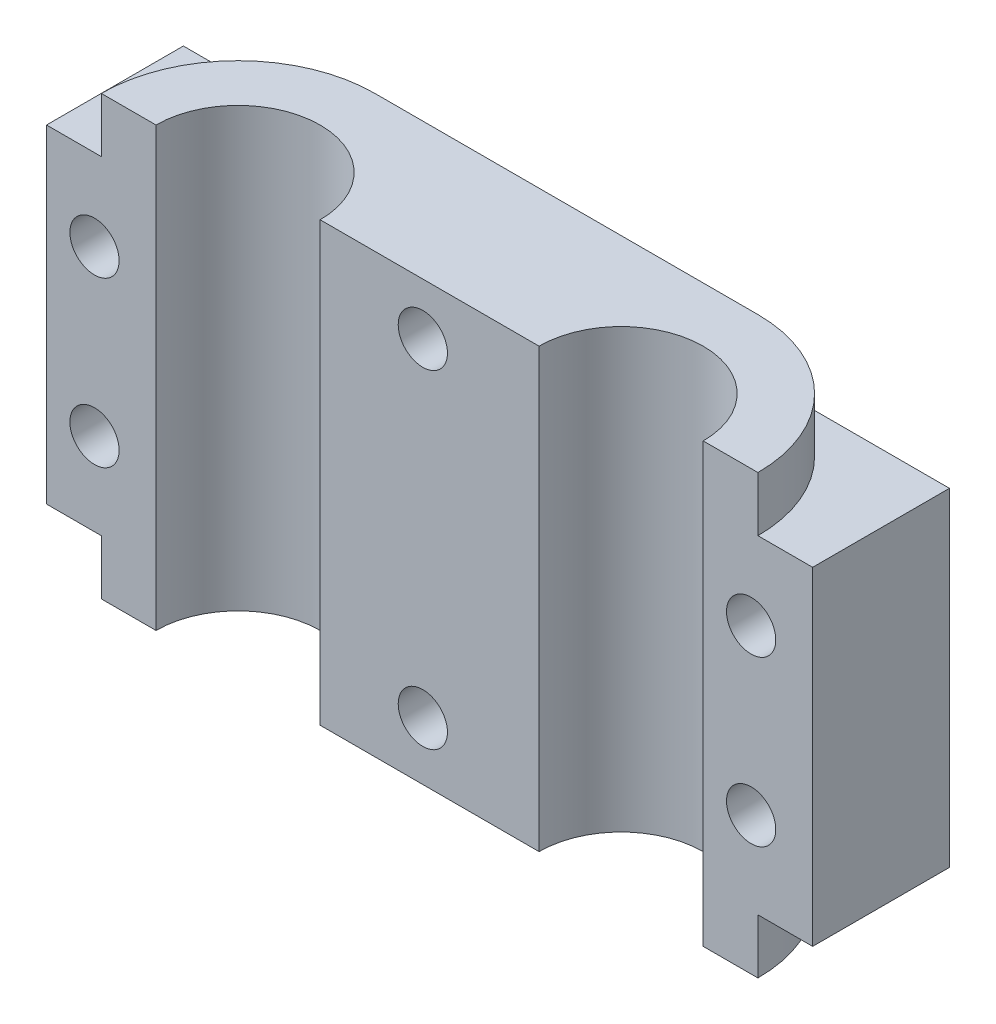
ISO-10303-21;
HEADER;
FILE_DESCRIPTION(('STEP AP214'),'2;1');
FILE_NAME('part.step','',(''),(''),'','','');
FILE_SCHEMA(('AUTOMOTIVE_DESIGN { 1 0 10303 214 1 1 1 1 }'));
ENDSEC;
DATA;
#1=APPLICATION_CONTEXT('core data for automotive mechanical design processes');
#2=APPLICATION_PROTOCOL_DEFINITION('international standard','automotive_design',2000,#1);
#3=PRODUCT_CONTEXT('',#1,'mechanical');
#4=PRODUCT('Part','Part','',(#3));
#5=PRODUCT_RELATED_PRODUCT_CATEGORY('part','',(#4));
#6=PRODUCT_DEFINITION_FORMATION('','',#4);
#7=PRODUCT_DEFINITION_CONTEXT('part definition',#1,'design');
#8=PRODUCT_DEFINITION('design','',#6,#7);
#9=PRODUCT_DEFINITION_SHAPE('','',#8);
#10=(LENGTH_UNIT() NAMED_UNIT(*) SI_UNIT(.MILLI.,.METRE.));
#11=(NAMED_UNIT(*) PLANE_ANGLE_UNIT() SI_UNIT($,.RADIAN.));
#12=(NAMED_UNIT(*) SI_UNIT($,.STERADIAN.) SOLID_ANGLE_UNIT());
#13=UNCERTAINTY_MEASURE_WITH_UNIT(LENGTH_MEASURE(1.E-05),#10,'distance_accuracy_value','');
#14=(GEOMETRIC_REPRESENTATION_CONTEXT(3) GLOBAL_UNCERTAINTY_ASSIGNED_CONTEXT((#13)) GLOBAL_UNIT_ASSIGNED_CONTEXT((#10,
#11,#12)) REPRESENTATION_CONTEXT('',''));
#15=CARTESIAN_POINT('',(0.,0.,0.));
#16=DIRECTION('',(0.,0.,1.));
#17=DIRECTION('',(1.,0.,0.));
#18=AXIS2_PLACEMENT_3D('',#15,#16,#17);
#19=CARTESIAN_POINT('',(17.5,20.,0.));
#20=DIRECTION('',(0.,-1.,0.));
#21=DIRECTION('',(0.,0.,-1.));
#22=AXIS2_PLACEMENT_3D('',#19,#20,#21);
#23=CYLINDRICAL_SURFACE('',#22,12.5);
#24=CARTESIAN_POINT('',(17.5,-15.,0.));
#25=DIRECTION('',(0.,1.,0.));
#26=DIRECTION('',(0.,0.,1.));
#27=AXIS2_PLACEMENT_3D('',#24,#25,#26);
#28=CIRCLE('',#27,12.5);
#29=CARTESIAN_POINT('',(30.,-15.,0.));
#30=VERTEX_POINT('',#29);
#31=CARTESIAN_POINT('',(17.5,-15.,-12.5));
#32=VERTEX_POINT('',#31);
#33=EDGE_CURVE('E54',#30,#32,#28,.T.);
#34=ORIENTED_EDGE('',*,*,#33,.F.);
#35=DIRECTION('',(0.,-1.,0.));
#36=VECTOR('',#35,1.);
#37=CARTESIAN_POINT('',(30.,20.,0.));
#38=LINE('',#37,#36);
#39=CARTESIAN_POINT('',(30.,-20.,0.));
#40=VERTEX_POINT('',#39);
#41=EDGE_CURVE('E47',#30,#40,#38,.T.);
#42=ORIENTED_EDGE('',*,*,#41,.T.);
#43=CARTESIAN_POINT('',(17.5,-20.,0.));
#44=DIRECTION('',(0.,1.,0.));
#45=DIRECTION('',(0.,0.,1.));
#46=AXIS2_PLACEMENT_3D('',#43,#44,#45);
#47=CIRCLE('',#46,12.5);
#48=CARTESIAN_POINT('',(17.5,-20.,-12.5));
#49=VERTEX_POINT('',#48);
#50=EDGE_CURVE('E213',#40,#49,#47,.T.);
#51=ORIENTED_EDGE('',*,*,#50,.T.);
#52=DIRECTION('',(0.,-1.,0.));
#53=VECTOR('',#52,1.);
#54=CARTESIAN_POINT('',(17.5,20.,-12.5));
#55=LINE('',#54,#53);
#56=EDGE_CURVE('E244',#32,#49,#55,.T.);
#57=ORIENTED_EDGE('',*,*,#56,.F.);
#58=EDGE_LOOP('',(#34,#42,#51,#57));
#59=FACE_BOUND('',#58,.T.);
#60=ADVANCED_FACE('F39',(#59),#23,.T.);
#61=CARTESIAN_POINT('',(-17.5,20.,0.));
#62=DIRECTION('',(0.,-1.,0.));
#63=DIRECTION('',(0.,0.,-1.));
#64=AXIS2_PLACEMENT_3D('',#61,#62,#63);
#65=CYLINDRICAL_SURFACE('',#64,12.5);
#66=DIRECTION('',(0.,-1.,0.));
#67=VECTOR('',#66,1.);
#68=CARTESIAN_POINT('',(-30.,20.,0.));
#69=LINE('',#68,#67);
#70=CARTESIAN_POINT('',(-30.,-15.,0.));
#71=VERTEX_POINT('',#70);
#72=CARTESIAN_POINT('',(-30.,-20.,0.));
#73=VERTEX_POINT('',#72);
#74=EDGE_CURVE('E237',#71,#73,#69,.T.);
#75=ORIENTED_EDGE('',*,*,#74,.F.);
#76=CARTESIAN_POINT('',(-17.5,-15.,0.));
#77=DIRECTION('',(0.,1.,0.));
#78=DIRECTION('',(0.,0.,1.));
#79=AXIS2_PLACEMENT_3D('',#76,#77,#78);
#80=CIRCLE('',#79,12.5);
#81=CARTESIAN_POINT('',(-17.5,-15.,-12.5));
#82=VERTEX_POINT('',#81);
#83=EDGE_CURVE('E263',#71,#82,#80,.F.);
#84=ORIENTED_EDGE('',*,*,#83,.T.);
#85=DIRECTION('',(0.,-1.,0.));
#86=VECTOR('',#85,1.);
#87=CARTESIAN_POINT('',(-17.5,20.,-12.5));
#88=LINE('',#87,#86);
#89=CARTESIAN_POINT('',(-17.5,-20.,-12.5));
#90=VERTEX_POINT('',#89);
#91=EDGE_CURVE('E241',#82,#90,#88,.T.);
#92=ORIENTED_EDGE('',*,*,#91,.T.);
#93=CARTESIAN_POINT('',(-17.5,-20.,0.));
#94=DIRECTION('',(0.,1.,0.));
#95=DIRECTION('',(0.,0.,1.));
#96=AXIS2_PLACEMENT_3D('',#93,#94,#95);
#97=CIRCLE('',#96,12.5);
#98=EDGE_CURVE('E219',#73,#90,#97,.F.);
#99=ORIENTED_EDGE('',*,*,#98,.F.);
#100=EDGE_LOOP('',(#75,#84,#92,#99));
#101=FACE_BOUND('',#100,.T.);
#102=ADVANCED_FACE('F261',(#101),#65,.T.);
#103=CARTESIAN_POINT('',(0.,20.,0.));
#104=DIRECTION('',(0.,0.,-1.));
#105=DIRECTION('',(-1.,0.,0.));
#106=AXIS2_PLACEMENT_3D('',#103,#104,#105);
#107=PLANE('',#106);
#108=CARTESIAN_POINT('',(29.3812113375367,-7.42900474648422,0.));
#109=DIRECTION('',(0.,0.,-1.));
#110=DIRECTION('',(-1.,0.,0.));
#111=AXIS2_PLACEMENT_3D('',#108,#109,#110);
#112=CIRCLE('',#111,2.24999999999999);
#113=CARTESIAN_POINT('',(27.1312113375367,-7.42900474648422,0.));
#114=VERTEX_POINT('',#113);
#115=EDGE_CURVE('E347',#114,#114,#112,.T.);
#116=ORIENTED_EDGE('',*,*,#115,.T.);
#117=EDGE_LOOP('',(#116));
#118=FACE_BOUND('',#117,.T.);
#119=CARTESIAN_POINT('',(29.3812113375367,7.57099525351577,0.));
#120=DIRECTION('',(0.,0.,-1.));
#121=DIRECTION('',(-1.,0.,0.));
#122=AXIS2_PLACEMENT_3D('',#119,#120,#121);
#123=CIRCLE('',#122,2.24999999999999);
#124=CARTESIAN_POINT('',(27.1312113375367,7.57099525351577,0.));
#125=VERTEX_POINT('',#124);
#126=EDGE_CURVE('E319',#125,#125,#123,.T.);
#127=ORIENTED_EDGE('',*,*,#126,.T.);
#128=EDGE_LOOP('',(#127));
#129=FACE_BOUND('',#128,.T.);
#130=DIRECTION('',(1.,0.,0.));
#131=VECTOR('',#130,1.);
#132=CARTESIAN_POINT('',(0.,-20.,0.));
#133=LINE('',#132,#131);
#134=CARTESIAN_POINT('',(25.,-20.,0.));
#135=VERTEX_POINT('',#134);
#136=EDGE_CURVE('E211',#135,#40,#133,.T.);
#137=ORIENTED_EDGE('',*,*,#136,.T.);
#138=ORIENTED_EDGE('',*,*,#41,.F.);
#139=DIRECTION('',(1.,0.,0.));
#140=VECTOR('',#139,1.);
#141=CARTESIAN_POINT('',(0.,-15.,0.));
#142=LINE('',#141,#140);
#143=CARTESIAN_POINT('',(35.,-15.,0.));
#144=VERTEX_POINT('',#143);
#145=EDGE_CURVE('E315',#30,#144,#142,.T.);
#146=ORIENTED_EDGE('',*,*,#145,.T.);
#147=DIRECTION('',(0.,-1.,0.));
#148=VECTOR('',#147,1.);
#149=CARTESIAN_POINT('',(35.,15.,0.));
#150=LINE('',#149,#148);
#151=CARTESIAN_POINT('',(35.,15.,0.));
#152=VERTEX_POINT('',#151);
#153=EDGE_CURVE('E158',#152,#144,#150,.T.);
#154=ORIENTED_EDGE('',*,*,#153,.F.);
#155=DIRECTION('',(1.,0.,0.));
#156=VECTOR('',#155,1.);
#157=CARTESIAN_POINT('',(0.,15.,0.));
#158=LINE('',#157,#156);
#159=CARTESIAN_POINT('',(30.,15.,0.));
#160=VERTEX_POINT('',#159);
#161=EDGE_CURVE('E153',#160,#152,#158,.T.);
#162=ORIENTED_EDGE('',*,*,#161,.F.);
#163=CARTESIAN_POINT('',(30.,20.,0.));
#164=VERTEX_POINT('',#163);
#165=EDGE_CURVE('E11',#164,#160,#38,.T.);
#166=ORIENTED_EDGE('',*,*,#165,.F.);
#167=DIRECTION('',(1.,0.,0.));
#168=VECTOR('',#167,1.);
#169=CARTESIAN_POINT('',(0.,20.,0.));
#170=LINE('',#169,#168);
#171=CARTESIAN_POINT('',(25.,20.,0.));
#172=VERTEX_POINT('',#171);
#173=EDGE_CURVE('E180',#172,#164,#170,.T.);
#174=ORIENTED_EDGE('',*,*,#173,.F.);
#175=DIRECTION('',(0.,-1.,0.));
#176=VECTOR('',#175,1.);
#177=CARTESIAN_POINT('',(25.,20.,0.));
#178=LINE('',#177,#176);
#179=EDGE_CURVE('E210',#172,#135,#178,.T.);
#180=ORIENTED_EDGE('',*,*,#179,.T.);
#181=EDGE_LOOP('',(#137,#138,#146,#154,#162,#166,#174,#180));
#182=FACE_BOUND('',#181,.T.);
#183=ADVANCED_FACE('F41',(#118,#129,#182),#107,.F.);
#184=ORIENTED_EDGE('',*,*,#165,.T.);
#185=CARTESIAN_POINT('',(17.5,15.,0.));
#186=DIRECTION('',(0.,1.,0.));
#187=DIRECTION('',(0.,0.,1.));
#188=AXIS2_PLACEMENT_3D('',#185,#186,#187);
#189=CIRCLE('',#188,12.5);
#190=CARTESIAN_POINT('',(17.5,15.,-12.5));
#191=VERTEX_POINT('',#190);
#192=EDGE_CURVE('E162',#160,#191,#189,.T.);
#193=ORIENTED_EDGE('',*,*,#192,.T.);
#194=CARTESIAN_POINT('',(17.5,20.,-12.5));
#195=VERTEX_POINT('',#194);
#196=EDGE_CURVE('E176',#195,#191,#55,.T.);
#197=ORIENTED_EDGE('',*,*,#196,.F.);
#198=CARTESIAN_POINT('',(17.5,20.,0.));
#199=DIRECTION('',(0.,1.,0.));
#200=DIRECTION('',(0.,0.,1.));
#201=AXIS2_PLACEMENT_3D('',#198,#199,#200);
#202=CIRCLE('',#201,12.5);
#203=EDGE_CURVE('E174',#164,#195,#202,.T.);
#204=ORIENTED_EDGE('',*,*,#203,.F.);
#205=EDGE_LOOP('',(#184,#193,#197,#204));
#206=FACE_BOUND('',#205,.T.);
#207=ADVANCED_FACE('F173',(#206),#23,.T.);
#208=CARTESIAN_POINT('',(0.,20.,-12.5));
#209=DIRECTION('',(0.,0.,1.));
#210=DIRECTION('',(1.,0.,0.));
#211=AXIS2_PLACEMENT_3D('',#208,#209,#210);
#212=PLANE('',#211);
#213=CARTESIAN_POINT('',(-0.618788662463317,-14.735944651477,-12.5));
#214=DIRECTION('',(0.,0.,-1.));
#215=DIRECTION('',(-1.,0.,0.));
#216=AXIS2_PLACEMENT_3D('',#213,#214,#215);
#217=CIRCLE('',#216,2.24999999999999);
#218=CARTESIAN_POINT('',(-2.86878866246331,-14.735944651477,-12.5));
#219=VERTEX_POINT('',#218);
#220=EDGE_CURVE('E356',#219,#219,#217,.T.);
#221=ORIENTED_EDGE('',*,*,#220,.F.);
#222=EDGE_LOOP('',(#221));
#223=FACE_BOUND('',#222,.T.);
#224=CARTESIAN_POINT('',(29.3812113375367,-7.42900474648422,-12.5));
#225=DIRECTION('',(0.,0.,-1.));
#226=DIRECTION('',(-1.,0.,0.));
#227=AXIS2_PLACEMENT_3D('',#224,#225,#226);
#228=CIRCLE('',#227,2.24999999999999);
#229=CARTESIAN_POINT('',(27.1312113375367,-7.42900474648422,-12.5));
#230=VERTEX_POINT('',#229);
#231=EDGE_CURVE('E350',#230,#230,#228,.T.);
#232=ORIENTED_EDGE('',*,*,#231,.F.);
#233=EDGE_LOOP('',(#232));
#234=FACE_BOUND('',#233,.T.);
#235=CARTESIAN_POINT('',(-30.6187886624633,-7.42900474648422,-12.5));
#236=DIRECTION('',(0.,0.,-1.));
#237=DIRECTION('',(-1.,0.,0.));
#238=AXIS2_PLACEMENT_3D('',#235,#236,#237);
#239=CIRCLE('',#238,2.24999999999999);
#240=CARTESIAN_POINT('',(-32.8687886624633,-7.42900474648422,-12.5));
#241=VERTEX_POINT('',#240);
#242=EDGE_CURVE('E344',#241,#241,#239,.T.);
#243=ORIENTED_EDGE('',*,*,#242,.F.);
#244=EDGE_LOOP('',(#243));
#245=FACE_BOUND('',#244,.T.);
#246=CARTESIAN_POINT('',(-30.6187886624633,7.57099525351577,-12.5));
#247=DIRECTION('',(0.,0.,-1.));
#248=DIRECTION('',(-1.,0.,0.));
#249=AXIS2_PLACEMENT_3D('',#246,#247,#248);
#250=CIRCLE('',#249,2.24999999999999);
#251=CARTESIAN_POINT('',(-32.8687886624633,7.57099525351577,-12.5));
#252=VERTEX_POINT('',#251);
#253=EDGE_CURVE('E338',#252,#252,#250,.T.);
#254=ORIENTED_EDGE('',*,*,#253,.F.);
#255=EDGE_LOOP('',(#254));
#256=FACE_BOUND('',#255,.T.);
#257=CARTESIAN_POINT('',(-0.618788662463317,15.264055348523,-12.5));
#258=DIRECTION('',(0.,0.,-1.));
#259=DIRECTION('',(-1.,0.,0.));
#260=AXIS2_PLACEMENT_3D('',#257,#258,#259);
#261=CIRCLE('',#260,2.24999999999999);
#262=CARTESIAN_POINT('',(-2.86878866246331,15.264055348523,-12.5));
#263=VERTEX_POINT('',#262);
#264=EDGE_CURVE('E332',#263,#263,#261,.T.);
#265=ORIENTED_EDGE('',*,*,#264,.F.);
#266=EDGE_LOOP('',(#265));
#267=FACE_BOUND('',#266,.T.);
#268=CARTESIAN_POINT('',(29.3812113375367,7.57099525351577,-12.5));
#269=DIRECTION('',(0.,0.,-1.));
#270=DIRECTION('',(-1.,0.,0.));
#271=AXIS2_PLACEMENT_3D('',#268,#269,#270);
#272=CIRCLE('',#271,2.24999999999999);
#273=CARTESIAN_POINT('',(27.1312113375367,7.57099525351577,-12.5));
#274=VERTEX_POINT('',#273);
#275=EDGE_CURVE('E326',#274,#274,#272,.T.);
#276=ORIENTED_EDGE('',*,*,#275,.F.);
#277=EDGE_LOOP('',(#276));
#278=FACE_BOUND('',#277,.T.);
#279=DIRECTION('',(-1.,0.,0.));
#280=VECTOR('',#279,1.);
#281=CARTESIAN_POINT('',(0.,-20.,-12.5));
#282=LINE('',#281,#280);
#283=EDGE_CURVE('E216',#49,#90,#282,.T.);
#284=ORIENTED_EDGE('',*,*,#283,.T.);
#285=ORIENTED_EDGE('',*,*,#91,.F.);
#286=DIRECTION('',(1.,0.,0.));
#287=VECTOR('',#286,1.);
#288=CARTESIAN_POINT('',(0.,-15.,-12.5));
#289=LINE('',#288,#287);
#290=CARTESIAN_POINT('',(-35.,-15.,-12.5));
#291=VERTEX_POINT('',#290);
#292=EDGE_CURVE('E265',#291,#82,#289,.T.);
#293=ORIENTED_EDGE('',*,*,#292,.F.);
#294=DIRECTION('',(0.,-1.,0.));
#295=VECTOR('',#294,1.);
#296=CARTESIAN_POINT('',(-35.,15.,-12.5));
#297=LINE('',#296,#295);
#298=CARTESIAN_POINT('',(-35.,15.,-12.5));
#299=VERTEX_POINT('',#298);
#300=EDGE_CURVE('E193',#299,#291,#297,.T.);
#301=ORIENTED_EDGE('',*,*,#300,.F.);
#302=DIRECTION('',(1.,0.,0.));
#303=VECTOR('',#302,1.);
#304=CARTESIAN_POINT('',(0.,15.,-12.5));
#305=LINE('',#304,#303);
#306=CARTESIAN_POINT('',(-17.5,15.,-12.5));
#307=VERTEX_POINT('',#306);
#308=EDGE_CURVE('E284',#299,#307,#305,.T.);
#309=ORIENTED_EDGE('',*,*,#308,.T.);
#310=CARTESIAN_POINT('',(-17.5,20.,-12.5));
#311=VERTEX_POINT('',#310);
#312=EDGE_CURVE('E242',#311,#307,#88,.T.);
#313=ORIENTED_EDGE('',*,*,#312,.F.);
#314=DIRECTION('',(-1.,0.,0.));
#315=VECTOR('',#314,1.);
#316=CARTESIAN_POINT('',(0.,20.,-12.5));
#317=LINE('',#316,#315);
#318=EDGE_CURVE('E179',#195,#311,#317,.T.);
#319=ORIENTED_EDGE('',*,*,#318,.F.);
#320=ORIENTED_EDGE('',*,*,#196,.T.);
#321=DIRECTION('',(-1.,0.,0.));
#322=VECTOR('',#321,1.);
#323=CARTESIAN_POINT('',(0.,15.,-12.5));
#324=LINE('',#323,#322);
#325=CARTESIAN_POINT('',(35.,15.,-12.5));
#326=VERTEX_POINT('',#325);
#327=EDGE_CURVE('E167',#326,#191,#324,.T.);
#328=ORIENTED_EDGE('',*,*,#327,.F.);
#329=DIRECTION('',(0.,-1.,0.));
#330=VECTOR('',#329,1.);
#331=CARTESIAN_POINT('',(35.,15.,-12.5));
#332=LINE('',#331,#330);
#333=CARTESIAN_POINT('',(35.,-15.,-12.5));
#334=VERTEX_POINT('',#333);
#335=EDGE_CURVE('E290',#326,#334,#332,.T.);
#336=ORIENTED_EDGE('',*,*,#335,.T.);
#337=DIRECTION('',(-1.,0.,0.));
#338=VECTOR('',#337,1.);
#339=CARTESIAN_POINT('',(0.,-15.,-12.5));
#340=LINE('',#339,#338);
#341=EDGE_CURVE('E171',#334,#32,#340,.T.);
#342=ORIENTED_EDGE('',*,*,#341,.T.);
#343=ORIENTED_EDGE('',*,*,#56,.T.);
#344=EDGE_LOOP('',(#284,#285,#293,#301,#309,#313,#319,#320,#328,#336,#342,#343));
#345=FACE_BOUND('',#344,.T.);
#346=ADVANCED_FACE('F247',(#223,#234,#245,#256,#267,#278,#345),#212,.F.);
#347=CARTESIAN_POINT('',(-17.5,15.,0.));
#348=DIRECTION('',(0.,1.,0.));
#349=DIRECTION('',(0.,0.,1.));
#350=AXIS2_PLACEMENT_3D('',#347,#348,#349);
#351=CIRCLE('',#350,12.5);
#352=CARTESIAN_POINT('',(-30.,15.,0.));
#353=VERTEX_POINT('',#352);
#354=EDGE_CURVE('E278',#353,#307,#351,.F.);
#355=ORIENTED_EDGE('',*,*,#354,.F.);
#356=CARTESIAN_POINT('',(-30.,20.,0.));
#357=VERTEX_POINT('',#356);
#358=EDGE_CURVE('E238',#357,#353,#69,.T.);
#359=ORIENTED_EDGE('',*,*,#358,.F.);
#360=CARTESIAN_POINT('',(-17.5,20.,0.));
#361=DIRECTION('',(0.,1.,0.));
#362=DIRECTION('',(0.,0.,1.));
#363=AXIS2_PLACEMENT_3D('',#360,#361,#362);
#364=CIRCLE('',#363,12.5);
#365=EDGE_CURVE('E197',#357,#311,#364,.F.);
#366=ORIENTED_EDGE('',*,*,#365,.T.);
#367=ORIENTED_EDGE('',*,*,#312,.T.);
#368=EDGE_LOOP('',(#355,#359,#366,#367));
#369=FACE_BOUND('',#368,.T.);
#370=ADVANCED_FACE('F301',(#369),#65,.T.);
#371=CARTESIAN_POINT('',(0.,20.,0.));
#372=DIRECTION('',(0.,0.,1.));
#373=DIRECTION('',(1.,0.,0.));
#374=AXIS2_PLACEMENT_3D('',#371,#372,#373);
#375=PLANE('',#374);
#376=CARTESIAN_POINT('',(-30.6187886624633,-7.42900474648422,0.));
#377=DIRECTION('',(0.,0.,1.));
#378=DIRECTION('',(1.,0.,0.));
#379=AXIS2_PLACEMENT_3D('',#376,#377,#378);
#380=CIRCLE('',#379,2.24999999999999);
#381=CARTESIAN_POINT('',(-28.3687886624633,-7.42900474648422,0.));
#382=VERTEX_POINT('',#381);
#383=EDGE_CURVE('E341',#382,#382,#380,.T.);
#384=ORIENTED_EDGE('',*,*,#383,.F.);
#385=EDGE_LOOP('',(#384));
#386=FACE_BOUND('',#385,.T.);
#387=CARTESIAN_POINT('',(-30.6187886624633,7.57099525351577,0.));
#388=DIRECTION('',(0.,0.,1.));
#389=DIRECTION('',(1.,0.,0.));
#390=AXIS2_PLACEMENT_3D('',#387,#388,#389);
#391=CIRCLE('',#390,2.24999999999999);
#392=CARTESIAN_POINT('',(-28.3687886624633,7.57099525351577,0.));
#393=VERTEX_POINT('',#392);
#394=EDGE_CURVE('E335',#393,#393,#391,.T.);
#395=ORIENTED_EDGE('',*,*,#394,.F.);
#396=EDGE_LOOP('',(#395));
#397=FACE_BOUND('',#396,.T.);
#398=DIRECTION('',(-1.,0.,0.));
#399=VECTOR('',#398,1.);
#400=CARTESIAN_POINT('',(0.,-20.,0.));
#401=LINE('',#400,#399);
#402=CARTESIAN_POINT('',(-25.,-20.,0.));
#403=VERTEX_POINT('',#402);
#404=EDGE_CURVE('E222',#403,#73,#401,.T.);
#405=ORIENTED_EDGE('',*,*,#404,.F.);
#406=DIRECTION('',(0.,-1.,0.));
#407=VECTOR('',#406,1.);
#408=CARTESIAN_POINT('',(-25.,20.,0.));
#409=LINE('',#408,#407);
#410=CARTESIAN_POINT('',(-25.,20.,0.));
#411=VERTEX_POINT('',#410);
#412=EDGE_CURVE('E235',#411,#403,#409,.T.);
#413=ORIENTED_EDGE('',*,*,#412,.F.);
#414=DIRECTION('',(-1.,0.,0.));
#415=VECTOR('',#414,1.);
#416=CARTESIAN_POINT('',(0.,20.,0.));
#417=LINE('',#416,#415);
#418=EDGE_CURVE('E200',#411,#357,#417,.T.);
#419=ORIENTED_EDGE('',*,*,#418,.T.);
#420=ORIENTED_EDGE('',*,*,#358,.T.);
#421=DIRECTION('',(-1.,0.,0.));
#422=VECTOR('',#421,1.);
#423=CARTESIAN_POINT('',(0.,15.,0.));
#424=LINE('',#423,#422);
#425=CARTESIAN_POINT('',(-35.,15.,0.));
#426=VERTEX_POINT('',#425);
#427=EDGE_CURVE('E275',#353,#426,#424,.T.);
#428=ORIENTED_EDGE('',*,*,#427,.T.);
#429=DIRECTION('',(0.,-1.,0.));
#430=VECTOR('',#429,1.);
#431=CARTESIAN_POINT('',(-35.,15.,0.));
#432=LINE('',#431,#430);
#433=CARTESIAN_POINT('',(-35.,-15.,0.));
#434=VERTEX_POINT('',#433);
#435=EDGE_CURVE('E281',#426,#434,#432,.T.);
#436=ORIENTED_EDGE('',*,*,#435,.T.);
#437=DIRECTION('',(-1.,0.,0.));
#438=VECTOR('',#437,1.);
#439=CARTESIAN_POINT('',(0.,-15.,0.));
#440=LINE('',#439,#438);
#441=EDGE_CURVE('E62',#71,#434,#440,.T.);
#442=ORIENTED_EDGE('',*,*,#441,.F.);
#443=ORIENTED_EDGE('',*,*,#74,.T.);
#444=EDGE_LOOP('',(#405,#413,#419,#420,#428,#436,#442,#443));
#445=FACE_BOUND('',#444,.T.);
#446=ADVANCED_FACE('F305',(#386,#397,#445),#375,.T.);
#447=CARTESIAN_POINT('',(-17.5,20.,0.));
#448=DIRECTION('',(0.,-1.,0.));
#449=DIRECTION('',(0.,0.,-1.));
#450=AXIS2_PLACEMENT_3D('',#447,#448,#449);
#451=CYLINDRICAL_SURFACE('',#450,7.5);
#452=CARTESIAN_POINT('',(-17.5,-20.,0.));
#453=DIRECTION('',(0.,1.,0.));
#454=DIRECTION('',(0.,0.,1.));
#455=AXIS2_PLACEMENT_3D('',#452,#453,#454);
#456=CIRCLE('',#455,7.5);
#457=CARTESIAN_POINT('',(-10.,-20.,0.));
#458=VERTEX_POINT('',#457);
#459=EDGE_CURVE('E225',#458,#403,#456,.T.);
#460=ORIENTED_EDGE('',*,*,#459,.F.);
#461=DIRECTION('',(0.,-1.,0.));
#462=VECTOR('',#461,1.);
#463=CARTESIAN_POINT('',(-10.,20.,0.));
#464=LINE('',#463,#462);
#465=CARTESIAN_POINT('',(-10.,20.,0.));
#466=VERTEX_POINT('',#465);
#467=EDGE_CURVE('E233',#466,#458,#464,.T.);
#468=ORIENTED_EDGE('',*,*,#467,.F.);
#469=CARTESIAN_POINT('',(-17.5,20.,0.));
#470=DIRECTION('',(0.,1.,0.));
#471=DIRECTION('',(0.,0.,1.));
#472=AXIS2_PLACEMENT_3D('',#469,#470,#471);
#473=CIRCLE('',#472,7.5);
#474=EDGE_CURVE('E203',#466,#411,#473,.T.);
#475=ORIENTED_EDGE('',*,*,#474,.T.);
#476=ORIENTED_EDGE('',*,*,#412,.T.);
#477=EDGE_LOOP('',(#460,#468,#475,#476));
#478=FACE_BOUND('',#477,.T.);
#479=ADVANCED_FACE('F308',(#478),#451,.F.);
#480=CARTESIAN_POINT('',(0.,20.,0.));
#481=DIRECTION('',(0.,0.,1.));
#482=DIRECTION('',(1.,0.,0.));
#483=AXIS2_PLACEMENT_3D('',#480,#481,#482);
#484=PLANE('',#483);
#485=CARTESIAN_POINT('',(-0.618788662463317,-14.735944651477,0.));
#486=DIRECTION('',(0.,0.,1.));
#487=DIRECTION('',(1.,0.,0.));
#488=AXIS2_PLACEMENT_3D('',#485,#486,#487);
#489=CIRCLE('',#488,2.24999999999999);
#490=CARTESIAN_POINT('',(1.63121133753667,-14.735944651477,0.));
#491=VERTEX_POINT('',#490);
#492=EDGE_CURVE('E353',#491,#491,#489,.T.);
#493=ORIENTED_EDGE('',*,*,#492,.F.);
#494=EDGE_LOOP('',(#493));
#495=FACE_BOUND('',#494,.T.);
#496=CARTESIAN_POINT('',(-0.618788662463317,15.264055348523,0.));
#497=DIRECTION('',(0.,0.,1.));
#498=DIRECTION('',(1.,0.,0.));
#499=AXIS2_PLACEMENT_3D('',#496,#497,#498);
#500=CIRCLE('',#499,2.24999999999999);
#501=CARTESIAN_POINT('',(1.63121133753667,15.264055348523,0.));
#502=VERTEX_POINT('',#501);
#503=EDGE_CURVE('E329',#502,#502,#500,.T.);
#504=ORIENTED_EDGE('',*,*,#503,.F.);
#505=EDGE_LOOP('',(#504));
#506=FACE_BOUND('',#505,.T.);
#507=DIRECTION('',(-1.,0.,0.));
#508=VECTOR('',#507,1.);
#509=CARTESIAN_POINT('',(0.,-20.,0.));
#510=LINE('',#509,#508);
#511=CARTESIAN_POINT('',(10.,-20.,0.));
#512=VERTEX_POINT('',#511);
#513=EDGE_CURVE('E190',#512,#458,#510,.T.);
#514=ORIENTED_EDGE('',*,*,#513,.F.);
#515=DIRECTION('',(0.,-1.,0.));
#516=VECTOR('',#515,1.);
#517=CARTESIAN_POINT('',(10.,20.,0.));
#518=LINE('',#517,#516);
#519=CARTESIAN_POINT('',(10.,20.,0.));
#520=VERTEX_POINT('',#519);
#521=EDGE_CURVE('E231',#520,#512,#518,.T.);
#522=ORIENTED_EDGE('',*,*,#521,.F.);
#523=DIRECTION('',(-1.,0.,0.));
#524=VECTOR('',#523,1.);
#525=CARTESIAN_POINT('',(0.,20.,0.));
#526=LINE('',#525,#524);
#527=EDGE_CURVE('E206',#520,#466,#526,.T.);
#528=ORIENTED_EDGE('',*,*,#527,.T.);
#529=ORIENTED_EDGE('',*,*,#467,.T.);
#530=EDGE_LOOP('',(#514,#522,#528,#529));
#531=FACE_BOUND('',#530,.T.);
#532=ADVANCED_FACE('F311',(#495,#506,#531),#484,.T.);
#533=CARTESIAN_POINT('',(17.5,20.,0.));
#534=DIRECTION('',(0.,-1.,0.));
#535=DIRECTION('',(0.,0.,-1.));
#536=AXIS2_PLACEMENT_3D('',#533,#534,#535);
#537=CYLINDRICAL_SURFACE('',#536,7.5);
#538=CARTESIAN_POINT('',(17.5,-20.,0.));
#539=DIRECTION('',(0.,1.,0.));
#540=DIRECTION('',(0.,0.,1.));
#541=AXIS2_PLACEMENT_3D('',#538,#539,#540);
#542=CIRCLE('',#541,7.5);
#543=EDGE_CURVE('E188',#512,#135,#542,.F.);
#544=ORIENTED_EDGE('',*,*,#543,.T.);
#545=ORIENTED_EDGE('',*,*,#179,.F.);
#546=CARTESIAN_POINT('',(17.5,20.,0.));
#547=DIRECTION('',(0.,1.,0.));
#548=DIRECTION('',(0.,0.,1.));
#549=AXIS2_PLACEMENT_3D('',#546,#547,#548);
#550=CIRCLE('',#549,7.5);
#551=EDGE_CURVE('E185',#520,#172,#550,.F.);
#552=ORIENTED_EDGE('',*,*,#551,.F.);
#553=ORIENTED_EDGE('',*,*,#521,.T.);
#554=EDGE_LOOP('',(#544,#545,#552,#553));
#555=FACE_BOUND('',#554,.T.);
#556=ADVANCED_FACE('F314',(#555),#537,.F.);
#557=CARTESIAN_POINT('',(0.,20.,0.));
#558=DIRECTION('',(0.,1.,0.));
#559=DIRECTION('',(0.,0.,1.));
#560=AXIS2_PLACEMENT_3D('',#557,#558,#559);
#561=PLANE('',#560);
#562=ORIENTED_EDGE('',*,*,#173,.T.);
#563=ORIENTED_EDGE('',*,*,#203,.T.);
#564=ORIENTED_EDGE('',*,*,#318,.T.);
#565=ORIENTED_EDGE('',*,*,#365,.F.);
#566=ORIENTED_EDGE('',*,*,#418,.F.);
#567=ORIENTED_EDGE('',*,*,#474,.F.);
#568=ORIENTED_EDGE('',*,*,#527,.F.);
#569=ORIENTED_EDGE('',*,*,#551,.T.);
#570=EDGE_LOOP('',(#562,#563,#564,#565,#566,#567,#568,#569));
#571=FACE_BOUND('',#570,.T.);
#572=ADVANCED_FACE('F182',(#571),#561,.T.);
#573=CARTESIAN_POINT('',(0.,-20.,0.));
#574=DIRECTION('',(0.,1.,0.));
#575=DIRECTION('',(0.,0.,1.));
#576=AXIS2_PLACEMENT_3D('',#573,#574,#575);
#577=PLANE('',#576);
#578=ORIENTED_EDGE('',*,*,#136,.F.);
#579=ORIENTED_EDGE('',*,*,#543,.F.);
#580=ORIENTED_EDGE('',*,*,#513,.T.);
#581=ORIENTED_EDGE('',*,*,#459,.T.);
#582=ORIENTED_EDGE('',*,*,#404,.T.);
#583=ORIENTED_EDGE('',*,*,#98,.T.);
#584=ORIENTED_EDGE('',*,*,#283,.F.);
#585=ORIENTED_EDGE('',*,*,#50,.F.);
#586=EDGE_LOOP('',(#578,#579,#580,#581,#582,#583,#584,#585));
#587=FACE_BOUND('',#586,.T.);
#588=ADVANCED_FACE('F256',(#587),#577,.F.);
#589=CARTESIAN_POINT('',(-35.,15.,0.));
#590=DIRECTION('',(-1.,0.,0.));
#591=DIRECTION('',(0.,0.,1.));
#592=AXIS2_PLACEMENT_3D('',#589,#590,#591);
#593=PLANE('',#592);
#594=DIRECTION('',(0.,0.,-1.));
#595=VECTOR('',#594,1.);
#596=CARTESIAN_POINT('',(-35.,-15.,0.));
#597=LINE('',#596,#595);
#598=EDGE_CURVE('E270',#434,#291,#597,.T.);
#599=ORIENTED_EDGE('',*,*,#598,.F.);
#600=ORIENTED_EDGE('',*,*,#435,.F.);
#601=DIRECTION('',(0.,0.,-1.));
#602=VECTOR('',#601,1.);
#603=CARTESIAN_POINT('',(-35.,15.,0.));
#604=LINE('',#603,#602);
#605=EDGE_CURVE('E282',#426,#299,#604,.T.);
#606=ORIENTED_EDGE('',*,*,#605,.T.);
#607=ORIENTED_EDGE('',*,*,#300,.T.);
#608=EDGE_LOOP('',(#599,#600,#606,#607));
#609=FACE_BOUND('',#608,.T.);
#610=ADVANCED_FACE('F407',(#609),#593,.T.);
#611=CARTESIAN_POINT('',(0.,15.,0.));
#612=DIRECTION('',(0.,1.,0.));
#613=DIRECTION('',(0.,0.,1.));
#614=AXIS2_PLACEMENT_3D('',#611,#612,#613);
#615=PLANE('',#614);
#616=ORIENTED_EDGE('',*,*,#427,.F.);
#617=ORIENTED_EDGE('',*,*,#354,.T.);
#618=ORIENTED_EDGE('',*,*,#308,.F.);
#619=ORIENTED_EDGE('',*,*,#605,.F.);
#620=EDGE_LOOP('',(#616,#617,#618,#619));
#621=FACE_BOUND('',#620,.T.);
#622=ADVANCED_FACE('F298',(#621),#615,.T.);
#623=CARTESIAN_POINT('',(0.,-15.,0.));
#624=DIRECTION('',(0.,1.,0.));
#625=DIRECTION('',(0.,0.,1.));
#626=AXIS2_PLACEMENT_3D('',#623,#624,#625);
#627=PLANE('',#626);
#628=ORIENTED_EDGE('',*,*,#441,.T.);
#629=ORIENTED_EDGE('',*,*,#598,.T.);
#630=ORIENTED_EDGE('',*,*,#292,.T.);
#631=ORIENTED_EDGE('',*,*,#83,.F.);
#632=EDGE_LOOP('',(#628,#629,#630,#631));
#633=FACE_BOUND('',#632,.T.);
#634=ADVANCED_FACE('F273',(#633),#627,.F.);
#635=CARTESIAN_POINT('',(35.,15.,0.));
#636=DIRECTION('',(-1.,0.,0.));
#637=DIRECTION('',(0.,0.,1.));
#638=AXIS2_PLACEMENT_3D('',#635,#636,#637);
#639=PLANE('',#638);
#640=DIRECTION('',(0.,0.,-1.));
#641=VECTOR('',#640,1.);
#642=CARTESIAN_POINT('',(35.,-15.,0.));
#643=LINE('',#642,#641);
#644=EDGE_CURVE('E316',#144,#334,#643,.T.);
#645=ORIENTED_EDGE('',*,*,#644,.T.);
#646=ORIENTED_EDGE('',*,*,#335,.F.);
#647=DIRECTION('',(0.,0.,-1.));
#648=VECTOR('',#647,1.);
#649=CARTESIAN_POINT('',(35.,15.,0.));
#650=LINE('',#649,#648);
#651=EDGE_CURVE('E161',#152,#326,#650,.T.);
#652=ORIENTED_EDGE('',*,*,#651,.F.);
#653=ORIENTED_EDGE('',*,*,#153,.T.);
#654=EDGE_LOOP('',(#645,#646,#652,#653));
#655=FACE_BOUND('',#654,.T.);
#656=ADVANCED_FACE('F414',(#655),#639,.F.);
#657=CARTESIAN_POINT('',(0.,15.,0.));
#658=DIRECTION('',(0.,1.,0.));
#659=DIRECTION('',(0.,0.,1.));
#660=AXIS2_PLACEMENT_3D('',#657,#658,#659);
#661=PLANE('',#660);
#662=ORIENTED_EDGE('',*,*,#192,.F.);
#663=ORIENTED_EDGE('',*,*,#161,.T.);
#664=ORIENTED_EDGE('',*,*,#651,.T.);
#665=ORIENTED_EDGE('',*,*,#327,.T.);
#666=EDGE_LOOP('',(#662,#663,#664,#665));
#667=FACE_BOUND('',#666,.T.);
#668=ADVANCED_FACE('F165',(#667),#661,.T.);
#669=CARTESIAN_POINT('',(0.,-15.,0.));
#670=DIRECTION('',(0.,1.,0.));
#671=DIRECTION('',(0.,0.,1.));
#672=AXIS2_PLACEMENT_3D('',#669,#670,#671);
#673=PLANE('',#672);
#674=ORIENTED_EDGE('',*,*,#33,.T.);
#675=ORIENTED_EDGE('',*,*,#341,.F.);
#676=ORIENTED_EDGE('',*,*,#644,.F.);
#677=ORIENTED_EDGE('',*,*,#145,.F.);
#678=EDGE_LOOP('',(#674,#675,#676,#677));
#679=FACE_BOUND('',#678,.T.);
#680=ADVANCED_FACE('F379',(#679),#673,.F.);
#681=CARTESIAN_POINT('',(29.3812113375367,7.57099525351577,-12.5));
#682=DIRECTION('',(0.,0.,-1.));
#683=DIRECTION('',(-1.,0.,0.));
#684=AXIS2_PLACEMENT_3D('',#681,#682,#683);
#685=CYLINDRICAL_SURFACE('',#684,2.24999999999999);
#686=ORIENTED_EDGE('',*,*,#275,.T.);
#687=EDGE_LOOP('',(#686));
#688=FACE_BOUND('',#687,.T.);
#689=ORIENTED_EDGE('',*,*,#126,.F.);
#690=EDGE_LOOP('',(#689));
#691=FACE_BOUND('',#690,.T.);
#692=ADVANCED_FACE('F375',(#688,#691),#685,.F.);
#693=CARTESIAN_POINT('',(-0.618788662463317,15.264055348523,-12.5));
#694=DIRECTION('',(0.,0.,-1.));
#695=DIRECTION('',(-1.,0.,0.));
#696=AXIS2_PLACEMENT_3D('',#693,#694,#695);
#697=CYLINDRICAL_SURFACE('',#696,2.24999999999999);
#698=ORIENTED_EDGE('',*,*,#503,.T.);
#699=EDGE_LOOP('',(#698));
#700=FACE_BOUND('',#699,.T.);
#701=ORIENTED_EDGE('',*,*,#264,.T.);
#702=EDGE_LOOP('',(#701));
#703=FACE_BOUND('',#702,.T.);
#704=ADVANCED_FACE('F378',(#700,#703),#697,.F.);
#705=CARTESIAN_POINT('',(-30.6187886624633,7.57099525351577,-12.5));
#706=DIRECTION('',(0.,0.,-1.));
#707=DIRECTION('',(-1.,0.,0.));
#708=AXIS2_PLACEMENT_3D('',#705,#706,#707);
#709=CYLINDRICAL_SURFACE('',#708,2.24999999999999);
#710=ORIENTED_EDGE('',*,*,#394,.T.);
#711=EDGE_LOOP('',(#710));
#712=FACE_BOUND('',#711,.T.);
#713=ORIENTED_EDGE('',*,*,#253,.T.);
#714=EDGE_LOOP('',(#713));
#715=FACE_BOUND('',#714,.T.);
#716=ADVANCED_FACE('F425',(#712,#715),#709,.F.);
#717=CARTESIAN_POINT('',(-30.6187886624633,-7.42900474648422,-12.5));
#718=DIRECTION('',(0.,0.,-1.));
#719=DIRECTION('',(-1.,0.,0.));
#720=AXIS2_PLACEMENT_3D('',#717,#718,#719);
#721=CYLINDRICAL_SURFACE('',#720,2.24999999999999);
#722=ORIENTED_EDGE('',*,*,#383,.T.);
#723=EDGE_LOOP('',(#722));
#724=FACE_BOUND('',#723,.T.);
#725=ORIENTED_EDGE('',*,*,#242,.T.);
#726=EDGE_LOOP('',(#725));
#727=FACE_BOUND('',#726,.T.);
#728=ADVANCED_FACE('F429',(#724,#727),#721,.F.);
#729=CARTESIAN_POINT('',(29.3812113375367,-7.42900474648422,-12.5));
#730=DIRECTION('',(0.,0.,-1.));
#731=DIRECTION('',(-1.,0.,0.));
#732=AXIS2_PLACEMENT_3D('',#729,#730,#731);
#733=CYLINDRICAL_SURFACE('',#732,2.24999999999999);
#734=ORIENTED_EDGE('',*,*,#231,.T.);
#735=EDGE_LOOP('',(#734));
#736=FACE_BOUND('',#735,.T.);
#737=ORIENTED_EDGE('',*,*,#115,.F.);
#738=EDGE_LOOP('',(#737));
#739=FACE_BOUND('',#738,.T.);
#740=ADVANCED_FACE('F433',(#736,#739),#733,.F.);
#741=CARTESIAN_POINT('',(-0.618788662463317,-14.735944651477,-12.5));
#742=DIRECTION('',(0.,0.,-1.));
#743=DIRECTION('',(-1.,0.,0.));
#744=AXIS2_PLACEMENT_3D('',#741,#742,#743);
#745=CYLINDRICAL_SURFACE('',#744,2.24999999999999);
#746=ORIENTED_EDGE('',*,*,#492,.T.);
#747=EDGE_LOOP('',(#746));
#748=FACE_BOUND('',#747,.T.);
#749=ORIENTED_EDGE('',*,*,#220,.T.);
#750=EDGE_LOOP('',(#749));
#751=FACE_BOUND('',#750,.T.);
#752=ADVANCED_FACE('F360',(#748,#751),#745,.F.);
#753=CLOSED_SHELL('',(#60,#102,#183,#207,#346,#370,#446,#479,#532,#556,#572,#588,#610,#622,#634,
#656,#668,#680,#692,#704,#716,#728,#740,#752));
#754=MANIFOLD_SOLID_BREP('B2',#753);
#755=ADVANCED_BREP_SHAPE_REPRESENTATION('',(#18,#754),#14);
#756=SHAPE_DEFINITION_REPRESENTATION(#9,#755);
ENDSEC;
END-ISO-10303-21;
